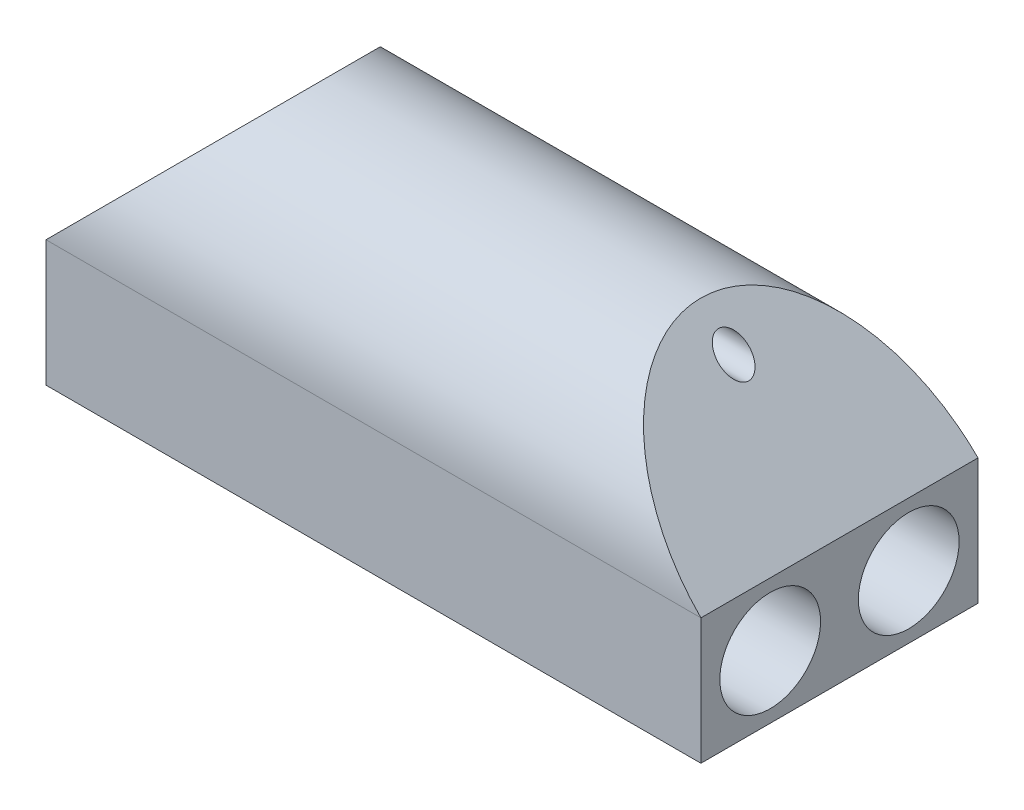
ISO-10303-21;
HEADER;
FILE_DESCRIPTION(('STEP AP214'),'2;1');
FILE_NAME('part.step','',(''),(''),'','','');
FILE_SCHEMA(('AUTOMOTIVE_DESIGN { 1 0 10303 214 1 1 1 1 }'));
ENDSEC;
DATA;
#1=APPLICATION_CONTEXT('core data for automotive mechanical design processes');
#2=APPLICATION_PROTOCOL_DEFINITION('international standard','automotive_design',2000,#1);
#3=PRODUCT_CONTEXT('',#1,'mechanical');
#4=PRODUCT('Part','Part','',(#3));
#5=PRODUCT_RELATED_PRODUCT_CATEGORY('part','',(#4));
#6=PRODUCT_DEFINITION_FORMATION('','',#4);
#7=PRODUCT_DEFINITION_CONTEXT('part definition',#1,'design');
#8=PRODUCT_DEFINITION('design','',#6,#7);
#9=PRODUCT_DEFINITION_SHAPE('','',#8);
#10=(LENGTH_UNIT() NAMED_UNIT(*) SI_UNIT(.MILLI.,.METRE.));
#11=(NAMED_UNIT(*) PLANE_ANGLE_UNIT() SI_UNIT($,.RADIAN.));
#12=(NAMED_UNIT(*) SI_UNIT($,.STERADIAN.) SOLID_ANGLE_UNIT());
#13=UNCERTAINTY_MEASURE_WITH_UNIT(LENGTH_MEASURE(1.E-05),#10,'distance_accuracy_value','');
#14=(GEOMETRIC_REPRESENTATION_CONTEXT(3) GLOBAL_UNCERTAINTY_ASSIGNED_CONTEXT((#13)) GLOBAL_UNIT_ASSIGNED_CONTEXT((#10,
#11,#12)) REPRESENTATION_CONTEXT('',''));
#15=CARTESIAN_POINT('',(0.,0.,0.));
#16=DIRECTION('',(0.,0.,1.));
#17=DIRECTION('',(1.,0.,0.));
#18=AXIS2_PLACEMENT_3D('',#15,#16,#17);
#19=CARTESIAN_POINT('',(0.,0.,0.));
#20=DIRECTION('',(0.,1.,0.));
#21=DIRECTION('',(0.,0.,1.));
#22=AXIS2_PLACEMENT_3D('',#19,#20,#21);
#23=PLANE('',#22);
#24=CARTESIAN_POINT('',(-40.3980332745251,0.,-6.985));
#25=DIRECTION('',(0.,1.,0.));
#26=DIRECTION('',(0.,0.,-1.));
#27=AXIS2_PLACEMENT_3D('',#24,#25,#26);
#28=CIRCLE('',#27,10.16);
#29=CARTESIAN_POINT('',(-33.0199999999999,0.,0.));
#30=VERTEX_POINT('',#29);
#31=CARTESIAN_POINT('',(-33.02,0.,-13.97));
#32=VERTEX_POINT('',#31);
#33=EDGE_CURVE('E146',#30,#32,#28,.T.);
#34=ORIENTED_EDGE('',*,*,#33,.T.);
#35=DIRECTION('',(-1.,0.,0.));
#36=VECTOR('',#35,1.);
#37=CARTESIAN_POINT('',(0.,0.,-13.97));
#38=LINE('',#37,#36);
#39=CARTESIAN_POINT('',(0.,0.,-13.97));
#40=VERTEX_POINT('',#39);
#41=EDGE_CURVE('E65',#40,#32,#38,.T.);
#42=ORIENTED_EDGE('',*,*,#41,.F.);
#43=DIRECTION('',(0.,0.,-1.));
#44=VECTOR('',#43,1.);
#45=CARTESIAN_POINT('',(0.,0.,0.));
#46=LINE('',#45,#44);
#47=CARTESIAN_POINT('',(0.,0.,0.));
#48=VERTEX_POINT('',#47);
#49=EDGE_CURVE('E120',#48,#40,#46,.T.);
#50=ORIENTED_EDGE('',*,*,#49,.F.);
#51=DIRECTION('',(1.,0.,0.));
#52=VECTOR('',#51,1.);
#53=CARTESIAN_POINT('',(0.,0.,0.));
#54=LINE('',#53,#52);
#55=EDGE_CURVE('E57',#30,#48,#54,.T.);
#56=ORIENTED_EDGE('',*,*,#55,.F.);
#57=EDGE_LOOP('',(#34,#42,#50,#56));
#58=FACE_BOUND('',#57,.T.);
#59=ADVANCED_FACE('F35',(#58),#23,.F.);
#60=CARTESIAN_POINT('',(-26.0350000000001,13.335,-13.97));
#61=DIRECTION('',(0.707106781186551,-0.707106781186544,0.));
#62=DIRECTION('',(0.707106781186544,0.707106781186551,0.));
#63=AXIS2_PLACEMENT_3D('',#60,#61,#62);
#64=PLANE('',#63);
#65=CARTESIAN_POINT('',(-27.6860000000001,11.684,-6.985));
#66=DIRECTION('',(0.707106781186551,-0.707106781186544,0.));
#67=DIRECTION('',(0.707106781186544,0.707106781186551,0.));
#68=AXIS2_PLACEMENT_3D('',#65,#66,#67);
#69=ELLIPSE('',#68,1.07763073452829,0.761999999999999);
#70=CARTESIAN_POINT('',(-26.9240000000001,12.446,-6.985));
#71=VERTEX_POINT('',#70);
#72=EDGE_CURVE('E128',#71,#71,#69,.T.);
#73=ORIENTED_EDGE('',*,*,#72,.T.);
#74=EDGE_LOOP('',(#73));
#75=FACE_BOUND('',#74,.T.);
#76=CARTESIAN_POINT('',(-40.3980332745251,-1.02803327452521,-6.985));
#77=DIRECTION('',(0.707106781186551,-0.707106781186544,0.));
#78=DIRECTION('',(-0.707106781186544,-0.707106781186551,0.));
#79=AXIS2_PLACEMENT_3D('',#76,#77,#78);
#80=ELLIPSE('',#79,14.3684097937108,10.16);
#81=CARTESIAN_POINT('',(-33.02,6.35,0.));
#82=VERTEX_POINT('',#81);
#83=CARTESIAN_POINT('',(-33.02,6.35,-13.97));
#84=VERTEX_POINT('',#83);
#85=EDGE_CURVE('E85',#82,#84,#80,.F.);
#86=ORIENTED_EDGE('',*,*,#85,.F.);
#87=CARTESIAN_POINT('',(-33.02,6.35,-6.985));
#88=DIRECTION('',(0.707106781186551,-0.707106781186544,0.));
#89=DIRECTION('',(0.707106781186544,0.707106781186551,0.));
#90=AXIS2_PLACEMENT_3D('',#87,#88,#89);
#91=ELLIPSE('',#90,9.87828173317602,6.985);
#92=EDGE_CURVE('E49',#82,#84,#91,.F.);
#93=ORIENTED_EDGE('',*,*,#92,.T.);
#94=EDGE_LOOP('',(#86,#93));
#95=FACE_BOUND('',#94,.T.);
#96=ADVANCED_FACE('F96',(#75,#95),#64,.F.);
#97=CARTESIAN_POINT('',(-33.02,3.175,-10.4775));
#98=DIRECTION('',(1.,0.,0.));
#99=DIRECTION('',(0.,0.,-1.));
#100=AXIS2_PLACEMENT_3D('',#97,#98,#99);
#101=CYLINDRICAL_SURFACE('',#100,2.54);
#102=CARTESIAN_POINT('',(0.,3.175,-10.4775));
#103=DIRECTION('',(1.,0.,0.));
#104=DIRECTION('',(0.,0.,1.));
#105=AXIS2_PLACEMENT_3D('',#102,#103,#104);
#106=CIRCLE('',#105,2.54);
#107=CARTESIAN_POINT('',(0.,3.175,-7.9375));
#108=VERTEX_POINT('',#107);
#109=EDGE_CURVE('E93',#108,#108,#106,.T.);
#110=ORIENTED_EDGE('',*,*,#109,.T.);
#111=EDGE_LOOP('',(#110));
#112=FACE_BOUND('',#111,.T.);
#113=CARTESIAN_POINT('',(-32.2227935991394,3.175,-13.0175));
#114=CARTESIAN_POINT('',(-32.2227966772723,3.30018653832456,-13.0175030201078));
#115=CARTESIAN_POINT('',(-32.215900607442,3.42535661642612,-13.0081915560159));
#116=CARTESIAN_POINT('',(-32.1890863608112,3.67160149412925,-12.9715923788197));
#117=CARTESIAN_POINT('',(-32.16916261152,3.79267451792812,-12.9442969731832));
#118=CARTESIAN_POINT('',(-32.1183891994343,4.02673881055394,-12.8735442429834));
#119=CARTESIAN_POINT('',(-32.0875989255978,4.13977007361573,-12.8301747051808));
#120=CARTESIAN_POINT('',(-32.0174995915055,4.35638522763789,-12.7292163983443));
#121=CARTESIAN_POINT('',(-31.9781876792693,4.45996593920316,-12.6716228679925));
#122=CARTESIAN_POINT('',(-31.8894371171887,4.66568853781863,-12.5380527919097));
#123=CARTESIAN_POINT('',(-31.8393927346041,4.7667708455449,-12.4608538726251));
#124=CARTESIAN_POINT('',(-31.7347431082981,4.95509408554005,-12.2937417512434));
#125=CARTESIAN_POINT('',(-31.6801355044006,5.04232778658789,-12.2038219528204));
#126=CARTESIAN_POINT('',(-31.5588217290378,5.2163243400535,-11.9960697280365));
#127=CARTESIAN_POINT('',(-31.4916860599448,5.30026593846721,-11.8761144870311));
#128=CARTESIAN_POINT('',(-31.3575503998917,5.44647153508358,-11.6235072149545));
#129=CARTESIAN_POINT('',(-31.2905505151298,5.50872243387198,-11.4908475728923));
#130=CARTESIAN_POINT('',(-31.1546539370554,5.61352781846064,-11.2054561336206));
#131=CARTESIAN_POINT('',(-31.0859735830159,5.65432090870956,-11.0519662231193));
#132=CARTESIAN_POINT('',(-30.9548618989512,5.70667728528842,-10.7374779802356));
#133=CARTESIAN_POINT('',(-30.8924284004545,5.71825074867378,-10.5764822819862));
#134=CARTESIAN_POINT('',(-30.7791422418122,5.71038637829767,-10.2605501842041));
#135=CARTESIAN_POINT('',(-30.7278568872538,5.69252580716083,-10.1057325919467));
#136=CARTESIAN_POINT('',(-30.6343248199334,5.62781684150893,-9.79946075021638));
#137=CARTESIAN_POINT('',(-30.5920723918641,5.58098684998462,-9.64800442870025));
#138=CARTESIAN_POINT('',(-30.5203960365493,5.46427664532614,-9.36764065410984));
#139=CARTESIAN_POINT('',(-30.4901645092619,5.39682206794475,-9.2379264920676));
#140=CARTESIAN_POINT('',(-30.4372293018164,5.23976025939415,-8.9909752041241));
#141=CARTESIAN_POINT('',(-30.4145236195897,5.15015893092111,-8.87373476553573));
#142=CARTESIAN_POINT('',(-30.3766974939606,4.95609336683187,-8.66117513604803));
#143=CARTESIAN_POINT('',(-30.3612678009352,4.85253805967185,-8.56507885118109));
#144=CARTESIAN_POINT('',(-30.3354239289379,4.63054157361901,-8.39114483451089));
#145=CARTESIAN_POINT('',(-30.3250095056098,4.51210112032185,-8.31330621324403));
#146=CARTESIAN_POINT('',(-30.3081668833979,4.26434392655092,-8.1786494347927));
#147=CARTESIAN_POINT('',(-30.3017190002024,4.13508457062313,-8.1217280506002));
#148=CARTESIAN_POINT('',(-30.2918163639892,3.86882325760849,-8.03004502411427));
#149=CARTESIAN_POINT('',(-30.2883617020157,3.73182106514443,-7.99528405587801));
#150=CARTESIAN_POINT('',(-30.2838216177865,3.45302526869234,-7.94878465300329));
#151=CARTESIAN_POINT('',(-30.2827514485585,3.3112066763051,-7.93719448456014));
#152=CARTESIAN_POINT('',(-30.2828102079114,3.02761995838668,-7.937817803255));
#153=CARTESIAN_POINT('',(-30.2839391913153,2.88585183420175,-7.95003188381141));
#154=CARTESIAN_POINT('',(-30.2886289005705,2.60600059542763,-7.99797471874004));
#155=CARTESIAN_POINT('',(-30.2921960518283,2.46792822196339,-8.03376559698812));
#156=CARTESIAN_POINT('',(-30.3024065684849,2.19980167345853,-8.12786739272736));
#157=CARTESIAN_POINT('',(-30.3090499028929,2.06974741765534,-8.1861780833445));
#158=CARTESIAN_POINT('',(-30.3263375871229,1.8216839706007,-8.32339274744581));
#159=CARTESIAN_POINT('',(-30.3369725634683,1.70364737771994,-8.40224834416381));
#160=CARTESIAN_POINT('',(-30.3633252401187,1.48266556997116,-8.57814674015882));
#161=CARTESIAN_POINT('',(-30.3790424886944,1.37971901503184,-8.6751879227183));
#162=CARTESIAN_POINT('',(-30.4164555484149,1.19239909324887,-8.88363639854859));
#163=CARTESIAN_POINT('',(-30.4381119987726,1.10790980721655,-8.99494662639658));
#164=CARTESIAN_POINT('',(-30.4881719493131,0.958807206228872,-9.22877402911151));
#165=CARTESIAN_POINT('',(-30.5165750958987,0.894192850027464,-9.35129061644171));
#166=CARTESIAN_POINT('',(-30.5805174487768,0.785963198910119,-9.60396998269557));
#167=CARTESIAN_POINT('',(-30.6160783222532,0.742413063624973,-9.73415510763248));
#168=CARTESIAN_POINT('',(-30.694053668157,0.676999300529445,-9.99785447069326));
#169=CARTESIAN_POINT('',(-30.7364692506968,0.655139189495105,-10.1313692450833));
#170=CARTESIAN_POINT('',(-30.8292032441223,0.632280748698048,-10.4032612843401));
#171=CARTESIAN_POINT('',(-30.8797650656614,0.632127875950936,-10.5416254546965));
#172=CARTESIAN_POINT('',(-30.9862335790107,0.653734088478593,-10.8145054102903));
#173=CARTESIAN_POINT('',(-31.0421418405564,0.67549962707143,-10.9490200501362));
#174=CARTESIAN_POINT('',(-31.1623153611567,0.742145033586789,-11.2218696058777));
#175=CARTESIAN_POINT('',(-31.2268913813566,0.788734272845651,-11.3596496788879));
#176=CARTESIAN_POINT('',(-31.3580387515858,0.90417459879641,-11.6246118270681));
#177=CARTESIAN_POINT('',(-31.4246116304093,0.973043158733938,-11.751785485037));
#178=CARTESIAN_POINT('',(-31.5620575341042,1.13764379685554,-12.0022767886119));
#179=CARTESIAN_POINT('',(-31.6328669342843,1.23503611345806,-12.1245434088621));
#180=CARTESIAN_POINT('',(-31.7693879606963,1.45230115504296,-12.3505846801099));
#181=CARTESIAN_POINT('',(-31.8351031008353,1.57215818576943,-12.454372142868));
#182=CARTESIAN_POINT('',(-31.9441835860862,1.80649195206969,-12.6211252962483));
#183=CARTESIAN_POINT('',(-31.9893908001693,1.91725605046111,-12.6881039319954));
#184=CARTESIAN_POINT('',(-32.0701445825426,2.15053709429673,-12.8053905256951));
#185=CARTESIAN_POINT('',(-32.1057004028498,2.27304263060551,-12.8557144593948));
#186=CARTESIAN_POINT('',(-32.1630382321084,2.52329069369005,-12.9358688692223));
#187=CARTESIAN_POINT('',(-32.1852168481098,2.65074892697718,-12.966291969961));
#188=CARTESIAN_POINT('',(-32.2150873450962,2.91048008082097,-13.0070982478488));
#189=CARTESIAN_POINT('',(-32.2227903473085,3.04274922557429,-13.0174968094685));
#190=CARTESIAN_POINT('',(-32.2227935991394,3.175,-13.0175));
#191=B_SPLINE_CURVE_WITH_KNOTS('',3,(#113,#114,#115,#116,#117,#118,#119,#120,#121,#122,#123,
#124,#125,#126,#127,#128,#129,#130,#131,#132,#133,#134,#135,#136,#137,#138,#139,#140,#141,#142,
#143,#144,#145,#146,#147,#148,#149,#150,#151,#152,#153,#154,#155,#156,#157,#158,#159,#160,#161,
#162,#163,#164,#165,#166,#167,#168,#169,#170,#171,#172,#173,#174,#175,#176,#177,#178,#179,#180,
#181,#182,#183,#184,#185,#186,#187,#188,#189,#190),.UNSPECIFIED.,.T.,.F.,(4,2,2,2,2,2,2,2,2,2,2,
2,2,2,2,2,2,2,2,2,2,2,2,2,2,2,2,2,2,2,2,2,2,2,2,2,2,2,4),(0.,0.375021190189892,
0.750202897868297,1.12336508858388,1.49665236075329,1.90519056026372,2.31394138632752,
2.79510586642771,3.27656042904469,3.79302431260913,4.30930828945736,4.79881530067425,
5.28801166862788,5.73361929078032,6.17910827451592,6.60342171805122,7.02771448589667,
7.44988430892716,7.87206697255697,8.29694257698478,8.72182877331251,9.1478390294207,
9.57384499383516,9.99885677480126,10.4238307896863,10.8460537413329,11.2682545689824,
11.691753201418,12.115320487838,12.5553805880568,12.9955702906578,13.4709645065695,
13.9467324726674,14.4591365974195,14.9711840727398,15.3808892682627,15.7902003140137,
16.1866885654343,16.5828720807903),.UNSPECIFIED.);
#192=CARTESIAN_POINT('',(-32.2227935991394,3.175,-13.0175));
#193=VERTEX_POINT('',#192);
#194=EDGE_CURVE('E94',#193,#193,#191,.T.);
#195=ORIENTED_EDGE('',*,*,#194,.F.);
#196=EDGE_LOOP('',(#195));
#197=FACE_BOUND('',#196,.T.);
#198=ADVANCED_FACE('F147',(#112,#197),#101,.F.);
#199=CARTESIAN_POINT('',(-33.02,3.175,-3.4925));
#200=DIRECTION('',(1.,0.,0.));
#201=DIRECTION('',(0.,0.,-1.));
#202=AXIS2_PLACEMENT_3D('',#199,#200,#201);
#203=CYLINDRICAL_SURFACE('',#202,2.54);
#204=CARTESIAN_POINT('',(0.,3.175,-3.4925));
#205=DIRECTION('',(1.,0.,0.));
#206=DIRECTION('',(0.,0.,-1.));
#207=AXIS2_PLACEMENT_3D('',#204,#205,#206);
#208=CIRCLE('',#207,2.54);
#209=CARTESIAN_POINT('',(0.,3.175,-6.0325));
#210=VERTEX_POINT('',#209);
#211=EDGE_CURVE('E129',#210,#210,#208,.T.);
#212=ORIENTED_EDGE('',*,*,#211,.T.);
#213=EDGE_LOOP('',(#212));
#214=FACE_BOUND('',#213,.T.);
#215=CARTESIAN_POINT('',(-30.2827802500081,3.175,-6.0325));
#216=CARTESIAN_POINT('',(-30.282780939726,3.31695056010636,-6.03250190815979));
#217=CARTESIAN_POINT('',(-30.2838822361316,3.45888281351642,-6.02057377342297));
#218=CARTESIAN_POINT('',(-30.2885101133527,3.73870929600429,-5.97321726028809));
#219=CARTESIAN_POINT('',(-30.2920361514961,3.87660442141807,-5.93779414027477));
#220=CARTESIAN_POINT('',(-30.3021431386377,4.14449569136922,-5.84447846141545));
#221=CARTESIAN_POINT('',(-30.3087249314702,4.27448964280844,-5.78657969673528));
#222=CARTESIAN_POINT('',(-30.3258812782511,4.52281674788083,-5.65005948789165));
#223=CARTESIAN_POINT('',(-30.3364558296214,4.64114990904327,-5.57143805710874));
#224=CARTESIAN_POINT('',(-30.3626297897476,4.86233039821777,-5.39626984774385));
#225=CARTESIAN_POINT('',(-30.3782097611563,4.96523540687207,-5.29979301089368));
#226=CARTESIAN_POINT('',(-30.415416095022,5.15322646670759,-5.09183216779012));
#227=CARTESIAN_POINT('',(-30.4370418431559,5.23831432678884,-4.98034968688634));
#228=CARTESIAN_POINT('',(-30.4869612423358,5.38814731172166,-4.74659784647973));
#229=CARTESIAN_POINT('',(-30.5152226749,5.45298730963365,-4.62438233996076));
#230=CARTESIAN_POINT('',(-30.5787633295993,5.5615739649936,-4.37264850407583));
#231=CARTESIAN_POINT('',(-30.6140428346096,5.60531977196135,-4.24312988049631));
#232=CARTESIAN_POINT('',(-30.6920936670566,5.67189306645257,-3.97838924981087));
#233=CARTESIAN_POINT('',(-30.7349870245932,5.69433487496833,-3.84310678487265));
#234=CARTESIAN_POINT('',(-30.8270753440615,5.7173522261186,-3.57284994399343));
#235=CARTESIAN_POINT('',(-30.8762719714834,5.71792197757359,-3.43787565911018));
#236=CARTESIAN_POINT('',(-30.9829676999657,5.6975663986833,-3.16333453639359));
#237=CARTESIAN_POINT('',(-31.0407907470423,5.67532251127417,-3.02399268379969));
#238=CARTESIAN_POINT('',(-31.1604270089222,5.60882845300609,-2.75247337838998));
#239=CARTESIAN_POINT('',(-31.2222416472391,5.56457039313603,-2.62029851278464));
#240=CARTESIAN_POINT('',(-31.3532584443024,5.45079865577947,-2.35450784292575));
#241=CARTESIAN_POINT('',(-31.4226341110333,5.37941584672289,-2.22177558861829));
#242=CARTESIAN_POINT('',(-31.5605545706362,5.21406415592915,-1.97050575209617));
#243=CARTESIAN_POINT('',(-31.6290984710906,5.12007294089013,-1.85198238042992));
#244=CARTESIAN_POINT('',(-31.7643247879779,4.90660530194709,-1.62752506968342));
#245=CARTESIAN_POINT('',(-31.8308109462809,4.78623088142613,-1.52232055948787));
#246=CARTESIAN_POINT('',(-31.9534386622881,4.52440743159231,-1.33460226448583));
#247=CARTESIAN_POINT('',(-32.0096003295543,4.38300036232295,-1.25204421214903));
#248=CARTESIAN_POINT('',(-32.0919530339844,4.12452450197372,-1.1336492668746));
#249=CARTESIAN_POINT('',(-32.1221324477263,4.01173926567244,-1.09120289805159));
#250=CARTESIAN_POINT('',(-32.1715554865904,3.77909173627619,-1.02241063557691));
#251=CARTESIAN_POINT('',(-32.1908105230222,3.65923697287831,-0.996047939178183));
#252=CARTESIAN_POINT('',(-32.2166099623691,3.41503168480745,-0.960847532486966));
#253=CARTESIAN_POINT('',(-32.2230963689691,3.29066324803801,-0.952089781717797));
#254=CARTESIAN_POINT('',(-32.2224690369678,3.04201466989851,-0.952939751303316));
#255=CARTESIAN_POINT('',(-32.2153551788563,2.91773452931393,-0.962547633043042));
#256=CARTESIAN_POINT('',(-32.1892674274897,2.68192396582766,-0.998165450317394));
#257=CARTESIAN_POINT('',(-32.1711592797924,2.57011028353011,-1.02297921758527));
#258=CARTESIAN_POINT('',(-32.1253999869006,2.35263673297545,-1.0866388561472));
#259=CARTESIAN_POINT('',(-32.0977462470724,2.24697854700956,-1.12548854274688));
#260=CARTESIAN_POINT('',(-32.0323047416177,2.03551147427037,-1.2192655663982));
#261=CARTESIAN_POINT('',(-31.9938852006304,1.93036100598287,-1.27522708831904));
#262=CARTESIAN_POINT('',(-31.9105885633132,1.73067953870902,-1.39979645384158));
#263=CARTESIAN_POINT('',(-31.8657081056341,1.63615411336586,-1.46841088548504));
#264=CARTESIAN_POINT('',(-31.763348719585,1.4428415637401,-1.62977187150449));
#265=CARTESIAN_POINT('',(-31.7050457534582,1.34626001087146,-1.72464019795408));
#266=CARTESIAN_POINT('',(-31.5855419030286,1.16998498144274,-1.92738476891507));
#267=CARTESIAN_POINT('',(-31.52433897478,1.09030363975981,-2.03527027354798));
#268=CARTESIAN_POINT('',(-31.3928297031656,0.938826493307999,-2.27824302499133));
#269=CARTESIAN_POINT('',(-31.3224666862038,0.869764182475836,-2.4150167160124));
#270=CARTESIAN_POINT('',(-31.1844944953541,0.756942471523875,-2.69998329188966));
#271=CARTESIAN_POINT('',(-31.116885957525,0.713188885205301,-2.848178791657));
#272=CARTESIAN_POINT('',(-30.9861855444922,0.652643520262337,-3.15474261063482));
#273=CARTESIAN_POINT('',(-30.9231777690143,0.636270921474231,-3.313231167563));
#274=CARTESIAN_POINT('',(-30.8052439941554,0.633873764258212,-3.63342757716466));
#275=CARTESIAN_POINT('',(-30.7503130502518,0.647830555323476,-3.79513339085384));
#276=CARTESIAN_POINT('',(-30.6541979417255,0.704855325686302,-4.10278714426746));
#277=CARTESIAN_POINT('',(-30.6122615471,0.745479263818787,-4.24895235690476));
#278=CARTESIAN_POINT('',(-30.5371114453085,0.853175501014854,-4.53357886462245));
#279=CARTESIAN_POINT('',(-30.503893571406,0.920235127510896,-4.67204381476725));
#280=CARTESIAN_POINT('',(-30.4481405778271,1.07313128416887,-4.92567124215827));
#281=CARTESIAN_POINT('',(-30.4249815393547,1.15713328451185,-5.04180643342965));
#282=CARTESIAN_POINT('',(-30.3851274767462,1.34414496075782,-5.25887462169461));
#283=CARTESIAN_POINT('',(-30.3684311693424,1.44715085716115,-5.35981063426796));
#284=CARTESIAN_POINT('',(-30.3408140425674,1.66626043347009,-5.54065963244715));
#285=CARTESIAN_POINT('',(-30.329752908643,1.78194851492975,-5.62105560418833));
#286=CARTESIAN_POINT('',(-30.3116909643005,2.02527292658786,-5.76174807555884));
#287=CARTESIAN_POINT('',(-30.3046911020473,2.15291203886289,-5.82203988017163));
#288=CARTESIAN_POINT('',(-30.2933925807005,2.42662602776476,-5.92447025135528));
#289=CARTESIAN_POINT('',(-30.2893409933586,2.57336441692773,-5.9648711369507));
#290=CARTESIAN_POINT('',(-30.2840344090119,2.87174204759842,-6.01888547740775));
#291=CARTESIAN_POINT('',(-30.2827795133149,3.02338146644012,-6.0324979618792));
#292=CARTESIAN_POINT('',(-30.2827802500081,3.175,-6.0325));
#293=B_SPLINE_CURVE_WITH_KNOTS('',3,(#215,#216,#217,#218,#219,#220,#221,#222,#223,#224,#225,
#226,#227,#228,#229,#230,#231,#232,#233,#234,#235,#236,#237,#238,#239,#240,#241,#242,#243,#244,
#245,#246,#247,#248,#249,#250,#251,#252,#253,#254,#255,#256,#257,#258,#259,#260,#261,#262,#263,
#264,#265,#266,#267,#268,#269,#270,#271,#272,#273,#274,#275,#276,#277,#278,#279,#280,#281,#282,
#283,#284,#285,#286,#287,#288,#289,#290,#291,#292),.UNSPECIFIED.,.T.,.F.,(4,2,2,2,2,2,2,2,2,2,2,
2,2,2,2,2,2,2,2,2,2,2,2,2,2,2,2,2,2,2,2,2,2,2,2,2,2,2,4),(0.,0.425318588981189,
0.850542020020345,1.27588294469666,1.70122359473223,2.12493210565385,2.54859757835587,
2.97024706435506,3.39191354908911,3.82107580036381,4.2503516823998,4.705917643569,
5.16164697935762,5.65720360692176,6.15325178610116,6.6699487514686,7.18562840161105,
7.55680538329194,7.92759392628081,8.30006277487051,8.67253489648528,9.01891411829597,
9.3653875653644,9.73945997637023,10.1137277099476,10.5542216683639,10.9950308523272,
11.4985367658284,12.0021582964548,12.5134215503766,13.0243705012261,13.4940227505119,
13.9634501342138,14.3968750719173,14.8302139027,15.2521587637378,15.6742020945561,
16.12847184081,16.5827580423493),.UNSPECIFIED.);
#294=CARTESIAN_POINT('',(-30.2827802500081,3.175,-6.0325));
#295=VERTEX_POINT('',#294);
#296=EDGE_CURVE('E39',#295,#295,#293,.T.);
#297=ORIENTED_EDGE('',*,*,#296,.F.);
#298=EDGE_LOOP('',(#297));
#299=FACE_BOUND('',#298,.T.);
#300=ADVANCED_FACE('F154',(#214,#299),#203,.F.);
#301=CARTESIAN_POINT('',(0.,6.35,0.));
#302=DIRECTION('',(-1.,0.,0.));
#303=DIRECTION('',(0.,0.,1.));
#304=AXIS2_PLACEMENT_3D('',#301,#302,#303);
#305=PLANE('',#304);
#306=ORIENTED_EDGE('',*,*,#211,.F.);
#307=EDGE_LOOP('',(#306));
#308=FACE_BOUND('',#307,.T.);
#309=ORIENTED_EDGE('',*,*,#109,.F.);
#310=EDGE_LOOP('',(#309));
#311=FACE_BOUND('',#310,.T.);
#312=DIRECTION('',(0.,-1.,0.));
#313=VECTOR('',#312,1.);
#314=CARTESIAN_POINT('',(0.,6.35,-13.97));
#315=LINE('',#314,#313);
#316=CARTESIAN_POINT('',(0.,6.35,-13.97));
#317=VERTEX_POINT('',#316);
#318=EDGE_CURVE('E101',#317,#40,#315,.T.);
#319=ORIENTED_EDGE('',*,*,#318,.F.);
#320=DIRECTION('',(0.,0.,1.));
#321=VECTOR('',#320,1.);
#322=CARTESIAN_POINT('',(0.,6.35,-13.97));
#323=LINE('',#322,#321);
#324=CARTESIAN_POINT('',(0.,6.35,0.));
#325=VERTEX_POINT('',#324);
#326=EDGE_CURVE('E117',#317,#325,#323,.T.);
#327=ORIENTED_EDGE('',*,*,#326,.T.);
#328=DIRECTION('',(0.,-1.,0.));
#329=VECTOR('',#328,1.);
#330=CARTESIAN_POINT('',(0.,6.35,0.));
#331=LINE('',#330,#329);
#332=EDGE_CURVE('E113',#325,#48,#331,.T.);
#333=ORIENTED_EDGE('',*,*,#332,.T.);
#334=ORIENTED_EDGE('',*,*,#49,.T.);
#335=EDGE_LOOP('',(#319,#327,#333,#334));
#336=FACE_BOUND('',#335,.T.);
#337=ADVANCED_FACE('F37',(#308,#311,#336),#305,.F.);
#338=CARTESIAN_POINT('',(0.,6.35,-13.97));
#339=DIRECTION('',(0.,0.,1.));
#340=DIRECTION('',(1.,0.,0.));
#341=AXIS2_PLACEMENT_3D('',#338,#339,#340);
#342=PLANE('',#341);
#343=ORIENTED_EDGE('',*,*,#41,.T.);
#344=DIRECTION('',(0.,-1.,0.));
#345=VECTOR('',#344,1.);
#346=CARTESIAN_POINT('',(-33.02,6.35,-13.97));
#347=LINE('',#346,#345);
#348=EDGE_CURVE('E89',#84,#32,#347,.T.);
#349=ORIENTED_EDGE('',*,*,#348,.F.);
#350=DIRECTION('',(-1.,0.,0.));
#351=VECTOR('',#350,1.);
#352=CARTESIAN_POINT('',(0.,6.35,-13.97));
#353=LINE('',#352,#351);
#354=EDGE_CURVE('E106',#317,#84,#353,.T.);
#355=ORIENTED_EDGE('',*,*,#354,.F.);
#356=ORIENTED_EDGE('',*,*,#318,.T.);
#357=EDGE_LOOP('',(#343,#349,#355,#356));
#358=FACE_BOUND('',#357,.T.);
#359=ADVANCED_FACE('F105',(#358),#342,.F.);
#360=CARTESIAN_POINT('',(0.,6.35,0.));
#361=DIRECTION('',(0.,0.,-1.));
#362=DIRECTION('',(-1.,0.,0.));
#363=AXIS2_PLACEMENT_3D('',#360,#361,#362);
#364=PLANE('',#363);
#365=ORIENTED_EDGE('',*,*,#55,.T.);
#366=ORIENTED_EDGE('',*,*,#332,.F.);
#367=DIRECTION('',(1.,0.,0.));
#368=VECTOR('',#367,1.);
#369=CARTESIAN_POINT('',(0.,6.35,0.));
#370=LINE('',#369,#368);
#371=EDGE_CURVE('E111',#82,#325,#370,.T.);
#372=ORIENTED_EDGE('',*,*,#371,.F.);
#373=DIRECTION('',(0.,-1.,0.));
#374=VECTOR('',#373,1.);
#375=CARTESIAN_POINT('',(-33.02,6.35,0.));
#376=LINE('',#375,#374);
#377=EDGE_CURVE('E90',#82,#30,#376,.T.);
#378=ORIENTED_EDGE('',*,*,#377,.T.);
#379=EDGE_LOOP('',(#365,#366,#372,#378));
#380=FACE_BOUND('',#379,.T.);
#381=ADVANCED_FACE('F174',(#380),#364,.F.);
#382=CARTESIAN_POINT('',(-48.638934822836,6.35,-6.985));
#383=DIRECTION('',(1.,0.,0.));
#384=DIRECTION('',(0.,0.,-1.));
#385=AXIS2_PLACEMENT_3D('',#382,#383,#384);
#386=CYLINDRICAL_SURFACE('',#385,6.985);
#387=CARTESIAN_POINT('',(0.,6.35,-6.985));
#388=DIRECTION('',(-0.707106781186551,-0.707106781186544,0.));
#389=DIRECTION('',(0.707106781186544,-0.707106781186551,0.));
#390=AXIS2_PLACEMENT_3D('',#387,#388,#389);
#391=ELLIPSE('',#390,9.87828173317602,6.985);
#392=EDGE_CURVE('E11',#317,#325,#391,.F.);
#393=ORIENTED_EDGE('',*,*,#392,.F.);
#394=ORIENTED_EDGE('',*,*,#354,.T.);
#395=ORIENTED_EDGE('',*,*,#92,.F.);
#396=ORIENTED_EDGE('',*,*,#371,.T.);
#397=EDGE_LOOP('',(#393,#394,#395,#396));
#398=FACE_BOUND('',#397,.T.);
#399=ADVANCED_FACE('F109',(#398),#386,.T.);
#400=CARTESIAN_POINT('',(-6.98499999999993,13.335,-13.97));
#401=DIRECTION('',(-0.707106781186551,-0.707106781186544,0.));
#402=DIRECTION('',(0.707106781186544,-0.707106781186551,0.));
#403=AXIS2_PLACEMENT_3D('',#400,#401,#402);
#404=PLANE('',#403);
#405=CARTESIAN_POINT('',(-5.33399999999995,11.684,-6.985));
#406=DIRECTION('',(-0.707106781186551,-0.707106781186544,0.));
#407=DIRECTION('',(0.707106781186544,-0.707106781186551,0.));
#408=AXIS2_PLACEMENT_3D('',#405,#406,#407);
#409=ELLIPSE('',#408,1.07763073452829,0.761999999999999);
#410=CARTESIAN_POINT('',(-4.57199999999995,10.922,-6.985));
#411=VERTEX_POINT('',#410);
#412=EDGE_CURVE('E126',#411,#411,#409,.T.);
#413=ORIENTED_EDGE('',*,*,#412,.T.);
#414=EDGE_LOOP('',(#413));
#415=FACE_BOUND('',#414,.T.);
#416=ORIENTED_EDGE('',*,*,#326,.F.);
#417=ORIENTED_EDGE('',*,*,#392,.T.);
#418=EDGE_LOOP('',(#416,#417));
#419=FACE_BOUND('',#418,.T.);
#420=ADVANCED_FACE('F191',(#415,#419),#404,.F.);
#421=CARTESIAN_POINT('',(-33.02,11.684,-6.985));
#422=DIRECTION('',(1.,0.,0.));
#423=DIRECTION('',(0.,0.,-1.));
#424=AXIS2_PLACEMENT_3D('',#421,#422,#423);
#425=CYLINDRICAL_SURFACE('',#424,0.761999999999999);
#426=ORIENTED_EDGE('',*,*,#412,.F.);
#427=EDGE_LOOP('',(#426));
#428=FACE_BOUND('',#427,.T.);
#429=ORIENTED_EDGE('',*,*,#72,.F.);
#430=EDGE_LOOP('',(#429));
#431=FACE_BOUND('',#430,.T.);
#432=ADVANCED_FACE('F152',(#428,#431),#425,.F.);
#433=CARTESIAN_POINT('',(-40.3980332745251,13.336,-6.985));
#434=DIRECTION('',(0.,-1.,0.));
#435=DIRECTION('',(0.,0.,-1.));
#436=AXIS2_PLACEMENT_3D('',#433,#434,#435);
#437=CYLINDRICAL_SURFACE('',#436,10.16);
#438=ORIENTED_EDGE('',*,*,#194,.T.);
#439=EDGE_LOOP('',(#438));
#440=FACE_BOUND('',#439,.T.);
#441=ORIENTED_EDGE('',*,*,#296,.T.);
#442=EDGE_LOOP('',(#441));
#443=FACE_BOUND('',#442,.T.);
#444=ORIENTED_EDGE('',*,*,#85,.T.);
#445=ORIENTED_EDGE('',*,*,#348,.T.);
#446=ORIENTED_EDGE('',*,*,#33,.F.);
#447=ORIENTED_EDGE('',*,*,#377,.F.);
#448=EDGE_LOOP('',(#444,#445,#446,#447));
#449=FACE_BOUND('',#448,.T.);
#450=ADVANCED_FACE('F87',(#440,#443,#449),#437,.F.);
#451=CLOSED_SHELL('',(#59,#96,#198,#300,#337,#359,#381,#399,#420,#432,#450));
#452=MANIFOLD_SOLID_BREP('B2',#451);
#453=ADVANCED_BREP_SHAPE_REPRESENTATION('',(#18,#452),#14);
#454=SHAPE_DEFINITION_REPRESENTATION(#9,#453);
ENDSEC;
END-ISO-10303-21;
